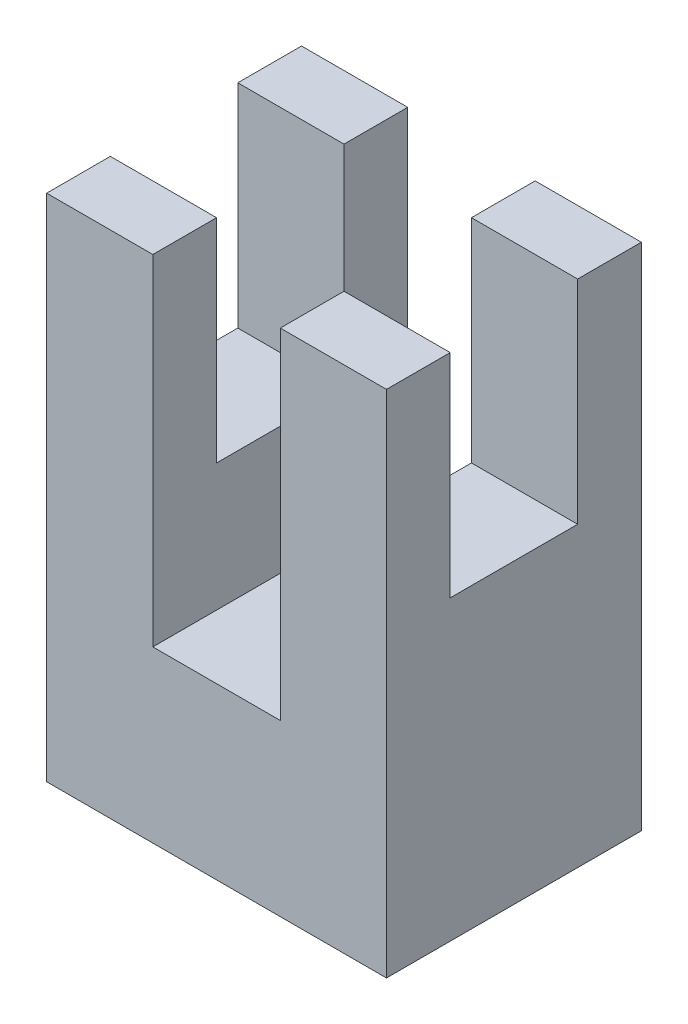
ISO-10303-21;
HEADER;
FILE_DESCRIPTION(('STEP AP214'),'2;1');
FILE_NAME('part.step','',(''),(''),'','','');
FILE_SCHEMA(('AUTOMOTIVE_DESIGN { 1 0 10303 214 1 1 1 1 }'));
ENDSEC;
DATA;
#1=APPLICATION_CONTEXT('core data for automotive mechanical design processes');
#2=APPLICATION_PROTOCOL_DEFINITION('international standard','automotive_design',2000,#1);
#3=PRODUCT_CONTEXT('',#1,'mechanical');
#4=PRODUCT('Part','Part','',(#3));
#5=PRODUCT_RELATED_PRODUCT_CATEGORY('part','',(#4));
#6=PRODUCT_DEFINITION_FORMATION('','',#4);
#7=PRODUCT_DEFINITION_CONTEXT('part definition',#1,'design');
#8=PRODUCT_DEFINITION('design','',#6,#7);
#9=PRODUCT_DEFINITION_SHAPE('','',#8);
#10=(LENGTH_UNIT() NAMED_UNIT(*) SI_UNIT(.MILLI.,.METRE.));
#11=(NAMED_UNIT(*) PLANE_ANGLE_UNIT() SI_UNIT($,.RADIAN.));
#12=(NAMED_UNIT(*) SI_UNIT($,.STERADIAN.) SOLID_ANGLE_UNIT());
#13=UNCERTAINTY_MEASURE_WITH_UNIT(LENGTH_MEASURE(1.E-05),#10,'distance_accuracy_value','');
#14=(GEOMETRIC_REPRESENTATION_CONTEXT(3) GLOBAL_UNCERTAINTY_ASSIGNED_CONTEXT((#13)) GLOBAL_UNIT_ASSIGNED_CONTEXT((#10,
#11,#12)) REPRESENTATION_CONTEXT('',''));
#15=CARTESIAN_POINT('',(0.,0.,0.));
#16=DIRECTION('',(0.,0.,1.));
#17=DIRECTION('',(1.,0.,0.));
#18=AXIS2_PLACEMENT_3D('',#15,#16,#17);
#19=CARTESIAN_POINT('',(-20.,60.,15.));
#20=DIRECTION('',(1.,0.,0.));
#21=DIRECTION('',(0.,1.,0.));
#22=AXIS2_PLACEMENT_3D('',#19,#20,#21);
#23=PLANE('',#22);
#24=DIRECTION('',(0.,-1.,0.));
#25=VECTOR('',#24,1.);
#26=CARTESIAN_POINT('',(-20.,60.,7.5));
#27=LINE('',#26,#25);
#28=CARTESIAN_POINT('',(-20.,60.,7.5));
#29=VERTEX_POINT('',#28);
#30=CARTESIAN_POINT('',(-20.,35.,7.5));
#31=VERTEX_POINT('',#30);
#32=EDGE_CURVE('E151',#29,#31,#27,.T.);
#33=ORIENTED_EDGE('',*,*,#32,.T.);
#34=DIRECTION('',(0.,0.,-1.));
#35=VECTOR('',#34,1.);
#36=CARTESIAN_POINT('',(-20.,35.,7.5));
#37=LINE('',#36,#35);
#38=CARTESIAN_POINT('',(-20.,35.,-7.5));
#39=VERTEX_POINT('',#38);
#40=EDGE_CURVE('E287',#31,#39,#37,.T.);
#41=ORIENTED_EDGE('',*,*,#40,.T.);
#42=DIRECTION('',(0.,1.,0.));
#43=VECTOR('',#42,1.);
#44=CARTESIAN_POINT('',(-20.,35.,-7.5));
#45=LINE('',#44,#43);
#46=CARTESIAN_POINT('',(-20.,60.,-7.5));
#47=VERTEX_POINT('',#46);
#48=EDGE_CURVE('E166',#39,#47,#45,.T.);
#49=ORIENTED_EDGE('',*,*,#48,.T.);
#50=DIRECTION('',(0.,0.,-1.));
#51=VECTOR('',#50,1.);
#52=CARTESIAN_POINT('',(-20.,60.,15.));
#53=LINE('',#52,#51);
#54=CARTESIAN_POINT('',(-20.,60.,-15.));
#55=VERTEX_POINT('',#54);
#56=EDGE_CURVE('E247',#47,#55,#53,.T.);
#57=ORIENTED_EDGE('',*,*,#56,.T.);
#58=DIRECTION('',(0.,-1.,0.));
#59=VECTOR('',#58,1.);
#60=CARTESIAN_POINT('',(-20.,60.,-15.));
#61=LINE('',#60,#59);
#62=CARTESIAN_POINT('',(-20.,0.,-15.));
#63=VERTEX_POINT('',#62);
#64=EDGE_CURVE('E212',#55,#63,#61,.T.);
#65=ORIENTED_EDGE('',*,*,#64,.T.);
#66=DIRECTION('',(0.,0.,-1.));
#67=VECTOR('',#66,1.);
#68=CARTESIAN_POINT('',(-20.,0.,15.));
#69=LINE('',#68,#67);
#70=CARTESIAN_POINT('',(-20.,0.,15.));
#71=VERTEX_POINT('',#70);
#72=EDGE_CURVE('E11',#71,#63,#69,.T.);
#73=ORIENTED_EDGE('',*,*,#72,.F.);
#74=DIRECTION('',(0.,-1.,0.));
#75=VECTOR('',#74,1.);
#76=CARTESIAN_POINT('',(-20.,60.,15.));
#77=LINE('',#76,#75);
#78=CARTESIAN_POINT('',(-20.,60.,15.));
#79=VERTEX_POINT('',#78);
#80=EDGE_CURVE('E223',#79,#71,#77,.T.);
#81=ORIENTED_EDGE('',*,*,#80,.F.);
#82=EDGE_CURVE('E176',#79,#29,#53,.T.);
#83=ORIENTED_EDGE('',*,*,#82,.T.);
#84=EDGE_LOOP('',(#33,#41,#49,#57,#65,#73,#81,#83));
#85=FACE_BOUND('',#84,.T.);
#86=ADVANCED_FACE('F33',(#85),#23,.F.);
#87=CARTESIAN_POINT('',(-7.5,20.,15.));
#88=DIRECTION('',(-1.,0.,0.));
#89=DIRECTION('',(0.,0.,1.));
#90=AXIS2_PLACEMENT_3D('',#87,#88,#89);
#91=PLANE('',#90);
#92=DIRECTION('',(0.,1.,0.));
#93=VECTOR('',#92,1.);
#94=CARTESIAN_POINT('',(-7.5,60.,7.5));
#95=LINE('',#94,#93);
#96=CARTESIAN_POINT('',(-7.5,35.,7.5));
#97=VERTEX_POINT('',#96);
#98=CARTESIAN_POINT('',(-7.5,60.,7.5));
#99=VERTEX_POINT('',#98);
#100=EDGE_CURVE('E148',#97,#99,#95,.T.);
#101=ORIENTED_EDGE('',*,*,#100,.T.);
#102=DIRECTION('',(0.,0.,-1.));
#103=VECTOR('',#102,1.);
#104=CARTESIAN_POINT('',(-7.5,60.,15.));
#105=LINE('',#104,#103);
#106=CARTESIAN_POINT('',(-7.5,60.,15.));
#107=VERTEX_POINT('',#106);
#108=EDGE_CURVE('E163',#107,#99,#105,.T.);
#109=ORIENTED_EDGE('',*,*,#108,.F.);
#110=DIRECTION('',(0.,1.,0.));
#111=VECTOR('',#110,1.);
#112=CARTESIAN_POINT('',(-7.5,20.,15.));
#113=LINE('',#112,#111);
#114=CARTESIAN_POINT('',(-7.5,20.,15.));
#115=VERTEX_POINT('',#114);
#116=EDGE_CURVE('E245',#115,#107,#113,.T.);
#117=ORIENTED_EDGE('',*,*,#116,.F.);
#118=DIRECTION('',(0.,0.,-1.));
#119=VECTOR('',#118,1.);
#120=CARTESIAN_POINT('',(-7.5,20.,15.));
#121=LINE('',#120,#119);
#122=CARTESIAN_POINT('',(-7.5,20.,-15.));
#123=VERTEX_POINT('',#122);
#124=EDGE_CURVE('E170',#115,#123,#121,.T.);
#125=ORIENTED_EDGE('',*,*,#124,.T.);
#126=DIRECTION('',(0.,1.,0.));
#127=VECTOR('',#126,1.);
#128=CARTESIAN_POINT('',(-7.5,20.,-15.));
#129=LINE('',#128,#127);
#130=CARTESIAN_POINT('',(-7.5,60.,-15.));
#131=VERTEX_POINT('',#130);
#132=EDGE_CURVE('E219',#123,#131,#129,.T.);
#133=ORIENTED_EDGE('',*,*,#132,.T.);
#134=CARTESIAN_POINT('',(-7.5,60.,-7.5));
#135=VERTEX_POINT('',#134);
#136=EDGE_CURVE('E171',#135,#131,#105,.T.);
#137=ORIENTED_EDGE('',*,*,#136,.F.);
#138=DIRECTION('',(0.,-1.,0.));
#139=VECTOR('',#138,1.);
#140=CARTESIAN_POINT('',(-7.5,35.,-7.5));
#141=LINE('',#140,#139);
#142=CARTESIAN_POINT('',(-7.5,35.,-7.5));
#143=VERTEX_POINT('',#142);
#144=EDGE_CURVE('E47',#135,#143,#141,.T.);
#145=ORIENTED_EDGE('',*,*,#144,.T.);
#146=DIRECTION('',(0.,0.,1.));
#147=VECTOR('',#146,1.);
#148=CARTESIAN_POINT('',(-7.5,35.,7.5));
#149=LINE('',#148,#147);
#150=EDGE_CURVE('E165',#143,#97,#149,.T.);
#151=ORIENTED_EDGE('',*,*,#150,.T.);
#152=EDGE_LOOP('',(#101,#109,#117,#125,#133,#137,#145,#151));
#153=FACE_BOUND('',#152,.T.);
#154=ADVANCED_FACE('F161',(#153),#91,.F.);
#155=CARTESIAN_POINT('',(-7.5,60.,15.));
#156=DIRECTION('',(0.,-1.,0.));
#157=DIRECTION('',(0.,0.,-1.));
#158=AXIS2_PLACEMENT_3D('',#155,#156,#157);
#159=PLANE('',#158);
#160=DIRECTION('',(-1.,0.,0.));
#161=VECTOR('',#160,1.);
#162=CARTESIAN_POINT('',(20.001,60.,7.5));
#163=LINE('',#162,#161);
#164=EDGE_CURVE('E145',#99,#29,#163,.T.);
#165=ORIENTED_EDGE('',*,*,#164,.T.);
#166=ORIENTED_EDGE('',*,*,#82,.F.);
#167=DIRECTION('',(-1.,0.,0.));
#168=VECTOR('',#167,1.);
#169=CARTESIAN_POINT('',(-7.5,60.,15.));
#170=LINE('',#169,#168);
#171=EDGE_CURVE('E169',#107,#79,#170,.T.);
#172=ORIENTED_EDGE('',*,*,#171,.F.);
#173=ORIENTED_EDGE('',*,*,#108,.T.);
#174=EDGE_LOOP('',(#165,#166,#172,#173));
#175=FACE_BOUND('',#174,.T.);
#176=ADVANCED_FACE('F168',(#175),#159,.F.);
#177=DIRECTION('',(-1.,0.,0.));
#178=VECTOR('',#177,1.);
#179=CARTESIAN_POINT('',(20.001,60.,-7.5));
#180=LINE('',#179,#178);
#181=EDGE_CURVE('E281',#135,#47,#180,.T.);
#182=ORIENTED_EDGE('',*,*,#181,.F.);
#183=ORIENTED_EDGE('',*,*,#136,.T.);
#184=DIRECTION('',(-1.,0.,0.));
#185=VECTOR('',#184,1.);
#186=CARTESIAN_POINT('',(-7.5,60.,-15.));
#187=LINE('',#186,#185);
#188=EDGE_CURVE('E221',#131,#55,#187,.T.);
#189=ORIENTED_EDGE('',*,*,#188,.T.);
#190=ORIENTED_EDGE('',*,*,#56,.F.);
#191=EDGE_LOOP('',(#182,#183,#189,#190));
#192=FACE_BOUND('',#191,.T.);
#193=ADVANCED_FACE('F294',(#192),#159,.F.);
#194=CARTESIAN_POINT('',(20.,60.,15.));
#195=DIRECTION('',(0.,-1.,0.));
#196=DIRECTION('',(1.,0.,0.));
#197=AXIS2_PLACEMENT_3D('',#194,#195,#196);
#198=PLANE('',#197);
#199=DIRECTION('',(0.,0.,-1.));
#200=VECTOR('',#199,1.);
#201=CARTESIAN_POINT('',(7.49999999999998,60.,15.));
#202=LINE('',#201,#200);
#203=CARTESIAN_POINT('',(7.49999999999998,60.,-7.5));
#204=VERTEX_POINT('',#203);
#205=CARTESIAN_POINT('',(7.49999999999998,60.,-15.));
#206=VERTEX_POINT('',#205);
#207=EDGE_CURVE('E182',#204,#206,#202,.T.);
#208=ORIENTED_EDGE('',*,*,#207,.F.);
#209=DIRECTION('',(1.,0.,0.));
#210=VECTOR('',#209,1.);
#211=CARTESIAN_POINT('',(-20.001,60.,-7.5));
#212=LINE('',#211,#210);
#213=CARTESIAN_POINT('',(20.,60.,-7.5));
#214=VERTEX_POINT('',#213);
#215=EDGE_CURVE('E250',#204,#214,#212,.T.);
#216=ORIENTED_EDGE('',*,*,#215,.T.);
#217=DIRECTION('',(0.,0.,-1.));
#218=VECTOR('',#217,1.);
#219=CARTESIAN_POINT('',(20.,60.,15.));
#220=LINE('',#219,#218);
#221=CARTESIAN_POINT('',(20.,60.,-15.));
#222=VERTEX_POINT('',#221);
#223=EDGE_CURVE('E186',#214,#222,#220,.T.);
#224=ORIENTED_EDGE('',*,*,#223,.T.);
#225=DIRECTION('',(-1.,0.,0.));
#226=VECTOR('',#225,1.);
#227=CARTESIAN_POINT('',(20.,60.,-15.));
#228=LINE('',#227,#226);
#229=EDGE_CURVE('E208',#222,#206,#228,.T.);
#230=ORIENTED_EDGE('',*,*,#229,.T.);
#231=EDGE_LOOP('',(#208,#216,#224,#230));
#232=FACE_BOUND('',#231,.T.);
#233=ADVANCED_FACE('F313',(#232),#198,.F.);
#234=CARTESIAN_POINT('',(-20.,0.,15.));
#235=DIRECTION('',(0.,1.,0.));
#236=DIRECTION('',(-1.,0.,0.));
#237=AXIS2_PLACEMENT_3D('',#234,#235,#236);
#238=PLANE('',#237);
#239=DIRECTION('',(1.,0.,0.));
#240=VECTOR('',#239,1.);
#241=CARTESIAN_POINT('',(-20.,0.,-15.));
#242=LINE('',#241,#240);
#243=CARTESIAN_POINT('',(20.,0.,-15.));
#244=VERTEX_POINT('',#243);
#245=EDGE_CURVE('E205',#63,#244,#242,.T.);
#246=ORIENTED_EDGE('',*,*,#245,.T.);
#247=DIRECTION('',(0.,0.,-1.));
#248=VECTOR('',#247,1.);
#249=CARTESIAN_POINT('',(20.,0.,15.));
#250=LINE('',#249,#248);
#251=CARTESIAN_POINT('',(20.,0.,15.));
#252=VERTEX_POINT('',#251);
#253=EDGE_CURVE('E40',#252,#244,#250,.T.);
#254=ORIENTED_EDGE('',*,*,#253,.F.);
#255=DIRECTION('',(1.,0.,0.));
#256=VECTOR('',#255,1.);
#257=CARTESIAN_POINT('',(-20.,0.,15.));
#258=LINE('',#257,#256);
#259=EDGE_CURVE('E228',#71,#252,#258,.T.);
#260=ORIENTED_EDGE('',*,*,#259,.F.);
#261=ORIENTED_EDGE('',*,*,#72,.T.);
#262=EDGE_LOOP('',(#246,#254,#260,#261));
#263=FACE_BOUND('',#262,.T.);
#264=ADVANCED_FACE('F296',(#263),#238,.F.);
#265=CARTESIAN_POINT('',(20.,0.,15.));
#266=DIRECTION('',(-1.,0.,0.));
#267=DIRECTION('',(0.,0.,1.));
#268=AXIS2_PLACEMENT_3D('',#265,#266,#267);
#269=PLANE('',#268);
#270=ORIENTED_EDGE('',*,*,#223,.F.);
#271=DIRECTION('',(0.,1.,0.));
#272=VECTOR('',#271,1.);
#273=CARTESIAN_POINT('',(20.,35.,-7.5));
#274=LINE('',#273,#272);
#275=CARTESIAN_POINT('',(20.,35.,-7.5));
#276=VERTEX_POINT('',#275);
#277=EDGE_CURVE('E262',#276,#214,#274,.T.);
#278=ORIENTED_EDGE('',*,*,#277,.F.);
#279=DIRECTION('',(0.,0.,-1.));
#280=VECTOR('',#279,1.);
#281=CARTESIAN_POINT('',(20.,35.,7.5));
#282=LINE('',#281,#280);
#283=CARTESIAN_POINT('',(20.,35.,7.5));
#284=VERTEX_POINT('',#283);
#285=EDGE_CURVE('E268',#284,#276,#282,.T.);
#286=ORIENTED_EDGE('',*,*,#285,.F.);
#287=DIRECTION('',(0.,-1.,0.));
#288=VECTOR('',#287,1.);
#289=CARTESIAN_POINT('',(20.,60.,7.5));
#290=LINE('',#289,#288);
#291=CARTESIAN_POINT('',(20.,60.,7.5));
#292=VERTEX_POINT('',#291);
#293=EDGE_CURVE('E272',#292,#284,#290,.T.);
#294=ORIENTED_EDGE('',*,*,#293,.F.);
#295=CARTESIAN_POINT('',(20.,60.,15.));
#296=VERTEX_POINT('',#295);
#297=EDGE_CURVE('E187',#296,#292,#220,.T.);
#298=ORIENTED_EDGE('',*,*,#297,.F.);
#299=DIRECTION('',(0.,1.,0.));
#300=VECTOR('',#299,1.);
#301=CARTESIAN_POINT('',(20.,0.,15.));
#302=LINE('',#301,#300);
#303=EDGE_CURVE('E200',#252,#296,#302,.T.);
#304=ORIENTED_EDGE('',*,*,#303,.F.);
#305=ORIENTED_EDGE('',*,*,#253,.T.);
#306=DIRECTION('',(0.,1.,0.));
#307=VECTOR('',#306,1.);
#308=CARTESIAN_POINT('',(20.,0.,-15.));
#309=LINE('',#308,#307);
#310=EDGE_CURVE('E197',#244,#222,#309,.T.);
#311=ORIENTED_EDGE('',*,*,#310,.T.);
#312=EDGE_LOOP('',(#270,#278,#286,#294,#298,#304,#305,#311));
#313=FACE_BOUND('',#312,.T.);
#314=ADVANCED_FACE('F196',(#313),#269,.F.);
#315=ORIENTED_EDGE('',*,*,#297,.T.);
#316=DIRECTION('',(1.,0.,0.));
#317=VECTOR('',#316,1.);
#318=CARTESIAN_POINT('',(-20.001,60.,7.5));
#319=LINE('',#318,#317);
#320=CARTESIAN_POINT('',(7.49999999999998,60.,7.5));
#321=VERTEX_POINT('',#320);
#322=EDGE_CURVE('E265',#321,#292,#319,.T.);
#323=ORIENTED_EDGE('',*,*,#322,.F.);
#324=CARTESIAN_POINT('',(7.49999999999998,60.,15.));
#325=VERTEX_POINT('',#324);
#326=EDGE_CURVE('E183',#325,#321,#202,.T.);
#327=ORIENTED_EDGE('',*,*,#326,.F.);
#328=DIRECTION('',(-1.,0.,0.));
#329=VECTOR('',#328,1.);
#330=CARTESIAN_POINT('',(20.,60.,15.));
#331=LINE('',#330,#329);
#332=EDGE_CURVE('E239',#296,#325,#331,.T.);
#333=ORIENTED_EDGE('',*,*,#332,.F.);
#334=EDGE_LOOP('',(#315,#323,#327,#333));
#335=FACE_BOUND('',#334,.T.);
#336=ADVANCED_FACE('F301',(#335),#198,.F.);
#337=CARTESIAN_POINT('',(7.49999999999998,60.,15.));
#338=DIRECTION('',(1.,0.,0.));
#339=DIRECTION('',(0.,1.,0.));
#340=AXIS2_PLACEMENT_3D('',#337,#338,#339);
#341=PLANE('',#340);
#342=DIRECTION('',(0.,0.,1.));
#343=VECTOR('',#342,1.);
#344=CARTESIAN_POINT('',(7.49999999999999,35.,7.5));
#345=LINE('',#344,#343);
#346=CARTESIAN_POINT('',(7.49999999999999,35.,-7.5));
#347=VERTEX_POINT('',#346);
#348=CARTESIAN_POINT('',(7.49999999999999,35.,7.5));
#349=VERTEX_POINT('',#348);
#350=EDGE_CURVE('E55',#347,#349,#345,.T.);
#351=ORIENTED_EDGE('',*,*,#350,.F.);
#352=DIRECTION('',(0.,-1.,0.));
#353=VECTOR('',#352,1.);
#354=CARTESIAN_POINT('',(7.49999999999999,35.,-7.5));
#355=LINE('',#354,#353);
#356=EDGE_CURVE('E274',#204,#347,#355,.T.);
#357=ORIENTED_EDGE('',*,*,#356,.F.);
#358=ORIENTED_EDGE('',*,*,#207,.T.);
#359=DIRECTION('',(0.,-1.,0.));
#360=VECTOR('',#359,1.);
#361=CARTESIAN_POINT('',(7.49999999999998,60.,-15.));
#362=LINE('',#361,#360);
#363=CARTESIAN_POINT('',(7.5,20.,-15.));
#364=VERTEX_POINT('',#363);
#365=EDGE_CURVE('E210',#206,#364,#362,.T.);
#366=ORIENTED_EDGE('',*,*,#365,.T.);
#367=DIRECTION('',(0.,0.,-1.));
#368=VECTOR('',#367,1.);
#369=CARTESIAN_POINT('',(7.5,20.,15.));
#370=LINE('',#369,#368);
#371=CARTESIAN_POINT('',(7.5,20.,15.));
#372=VERTEX_POINT('',#371);
#373=EDGE_CURVE('E174',#372,#364,#370,.T.);
#374=ORIENTED_EDGE('',*,*,#373,.F.);
#375=DIRECTION('',(0.,-1.,0.));
#376=VECTOR('',#375,1.);
#377=CARTESIAN_POINT('',(7.49999999999998,60.,15.));
#378=LINE('',#377,#376);
#379=EDGE_CURVE('E241',#325,#372,#378,.T.);
#380=ORIENTED_EDGE('',*,*,#379,.F.);
#381=ORIENTED_EDGE('',*,*,#326,.T.);
#382=DIRECTION('',(0.,1.,0.));
#383=VECTOR('',#382,1.);
#384=CARTESIAN_POINT('',(7.49999999999998,60.,7.5));
#385=LINE('',#384,#383);
#386=EDGE_CURVE('E235',#349,#321,#385,.T.);
#387=ORIENTED_EDGE('',*,*,#386,.F.);
#388=EDGE_LOOP('',(#351,#357,#358,#366,#374,#380,#381,#387));
#389=FACE_BOUND('',#388,.T.);
#390=ADVANCED_FACE('F305',(#389),#341,.F.);
#391=CARTESIAN_POINT('',(7.5,20.,15.));
#392=DIRECTION('',(0.,-1.,0.));
#393=DIRECTION('',(1.,0.,0.));
#394=AXIS2_PLACEMENT_3D('',#391,#392,#393);
#395=PLANE('',#394);
#396=DIRECTION('',(-1.,0.,0.));
#397=VECTOR('',#396,1.);
#398=CARTESIAN_POINT('',(7.5,20.,-15.));
#399=LINE('',#398,#397);
#400=EDGE_CURVE('E217',#364,#123,#399,.T.);
#401=ORIENTED_EDGE('',*,*,#400,.T.);
#402=ORIENTED_EDGE('',*,*,#124,.F.);
#403=DIRECTION('',(-1.,0.,0.));
#404=VECTOR('',#403,1.);
#405=CARTESIAN_POINT('',(7.5,20.,15.));
#406=LINE('',#405,#404);
#407=EDGE_CURVE('E243',#372,#115,#406,.T.);
#408=ORIENTED_EDGE('',*,*,#407,.F.);
#409=ORIENTED_EDGE('',*,*,#373,.T.);
#410=EDGE_LOOP('',(#401,#402,#408,#409));
#411=FACE_BOUND('',#410,.T.);
#412=ADVANCED_FACE('F309',(#411),#395,.F.);
#413=CARTESIAN_POINT('',(0.,0.,15.));
#414=DIRECTION('',(0.,0.,1.));
#415=DIRECTION('',(1.,0.,0.));
#416=AXIS2_PLACEMENT_3D('',#413,#414,#415);
#417=PLANE('',#416);
#418=ORIENTED_EDGE('',*,*,#80,.T.);
#419=ORIENTED_EDGE('',*,*,#259,.T.);
#420=ORIENTED_EDGE('',*,*,#303,.T.);
#421=ORIENTED_EDGE('',*,*,#332,.T.);
#422=ORIENTED_EDGE('',*,*,#379,.T.);
#423=ORIENTED_EDGE('',*,*,#407,.T.);
#424=ORIENTED_EDGE('',*,*,#116,.T.);
#425=ORIENTED_EDGE('',*,*,#171,.T.);
#426=EDGE_LOOP('',(#418,#419,#420,#421,#422,#423,#424,#425));
#427=FACE_BOUND('',#426,.T.);
#428=ADVANCED_FACE('F297',(#427),#417,.T.);
#429=CARTESIAN_POINT('',(0.,0.,-15.));
#430=DIRECTION('',(0.,0.,1.));
#431=DIRECTION('',(1.,0.,0.));
#432=AXIS2_PLACEMENT_3D('',#429,#430,#431);
#433=PLANE('',#432);
#434=ORIENTED_EDGE('',*,*,#64,.F.);
#435=ORIENTED_EDGE('',*,*,#188,.F.);
#436=ORIENTED_EDGE('',*,*,#132,.F.);
#437=ORIENTED_EDGE('',*,*,#400,.F.);
#438=ORIENTED_EDGE('',*,*,#365,.F.);
#439=ORIENTED_EDGE('',*,*,#229,.F.);
#440=ORIENTED_EDGE('',*,*,#310,.F.);
#441=ORIENTED_EDGE('',*,*,#245,.F.);
#442=EDGE_LOOP('',(#434,#435,#436,#437,#438,#439,#440,#441));
#443=FACE_BOUND('',#442,.T.);
#444=ADVANCED_FACE('F204',(#443),#433,.F.);
#445=CARTESIAN_POINT('',(-20.001,35.,-7.5));
#446=DIRECTION('',(0.,0.,-1.));
#447=DIRECTION('',(0.,1.,0.));
#448=AXIS2_PLACEMENT_3D('',#445,#446,#447);
#449=PLANE('',#448);
#450=ORIENTED_EDGE('',*,*,#356,.T.);
#451=DIRECTION('',(1.,0.,0.));
#452=VECTOR('',#451,1.);
#453=CARTESIAN_POINT('',(-20.001,35.,-7.5));
#454=LINE('',#453,#452);
#455=EDGE_CURVE('E255',#347,#276,#454,.T.);
#456=ORIENTED_EDGE('',*,*,#455,.T.);
#457=ORIENTED_EDGE('',*,*,#277,.T.);
#458=ORIENTED_EDGE('',*,*,#215,.F.);
#459=EDGE_LOOP('',(#450,#456,#457,#458));
#460=FACE_BOUND('',#459,.T.);
#461=ADVANCED_FACE('F359',(#460),#449,.F.);
#462=CARTESIAN_POINT('',(-20.001,35.,7.5));
#463=DIRECTION('',(0.,-1.,0.));
#464=DIRECTION('',(0.,0.,-1.));
#465=AXIS2_PLACEMENT_3D('',#462,#463,#464);
#466=PLANE('',#465);
#467=ORIENTED_EDGE('',*,*,#350,.T.);
#468=DIRECTION('',(1.,0.,0.));
#469=VECTOR('',#468,1.);
#470=CARTESIAN_POINT('',(-20.001,35.,7.5));
#471=LINE('',#470,#469);
#472=EDGE_CURVE('E259',#349,#284,#471,.T.);
#473=ORIENTED_EDGE('',*,*,#472,.T.);
#474=ORIENTED_EDGE('',*,*,#285,.T.);
#475=ORIENTED_EDGE('',*,*,#455,.F.);
#476=EDGE_LOOP('',(#467,#473,#474,#475));
#477=FACE_BOUND('',#476,.T.);
#478=ADVANCED_FACE('F364',(#477),#466,.F.);
#479=CARTESIAN_POINT('',(-20.001,60.,7.5));
#480=DIRECTION('',(0.,0.,1.));
#481=DIRECTION('',(0.,-1.,0.));
#482=AXIS2_PLACEMENT_3D('',#479,#480,#481);
#483=PLANE('',#482);
#484=ORIENTED_EDGE('',*,*,#386,.T.);
#485=ORIENTED_EDGE('',*,*,#322,.T.);
#486=ORIENTED_EDGE('',*,*,#293,.T.);
#487=ORIENTED_EDGE('',*,*,#472,.F.);
#488=EDGE_LOOP('',(#484,#485,#486,#487));
#489=FACE_BOUND('',#488,.T.);
#490=ADVANCED_FACE('F371',(#489),#483,.F.);
#491=CARTESIAN_POINT('',(20.001,60.,7.5));
#492=DIRECTION('',(0.,0.,-1.));
#493=DIRECTION('',(0.,1.,0.));
#494=AXIS2_PLACEMENT_3D('',#491,#492,#493);
#495=PLANE('',#494);
#496=DIRECTION('',(-1.,0.,0.));
#497=VECTOR('',#496,1.);
#498=CARTESIAN_POINT('',(20.001,35.,7.5));
#499=LINE('',#498,#497);
#500=EDGE_CURVE('E156',#97,#31,#499,.T.);
#501=ORIENTED_EDGE('',*,*,#500,.T.);
#502=ORIENTED_EDGE('',*,*,#32,.F.);
#503=ORIENTED_EDGE('',*,*,#164,.F.);
#504=ORIENTED_EDGE('',*,*,#100,.F.);
#505=EDGE_LOOP('',(#501,#502,#503,#504));
#506=FACE_BOUND('',#505,.T.);
#507=ADVANCED_FACE('F147',(#506),#495,.T.);
#508=CARTESIAN_POINT('',(20.001,35.,7.5));
#509=DIRECTION('',(0.,1.,0.));
#510=DIRECTION('',(0.,0.,1.));
#511=AXIS2_PLACEMENT_3D('',#508,#509,#510);
#512=PLANE('',#511);
#513=DIRECTION('',(-1.,0.,0.));
#514=VECTOR('',#513,1.);
#515=CARTESIAN_POINT('',(20.001,35.,-7.5));
#516=LINE('',#515,#514);
#517=EDGE_CURVE('E283',#143,#39,#516,.T.);
#518=ORIENTED_EDGE('',*,*,#517,.T.);
#519=ORIENTED_EDGE('',*,*,#40,.F.);
#520=ORIENTED_EDGE('',*,*,#500,.F.);
#521=ORIENTED_EDGE('',*,*,#150,.F.);
#522=EDGE_LOOP('',(#518,#519,#520,#521));
#523=FACE_BOUND('',#522,.T.);
#524=ADVANCED_FACE('F384',(#523),#512,.T.);
#525=CARTESIAN_POINT('',(20.001,35.,-7.5));
#526=DIRECTION('',(0.,0.,1.));
#527=DIRECTION('',(0.,-1.,0.));
#528=AXIS2_PLACEMENT_3D('',#525,#526,#527);
#529=PLANE('',#528);
#530=ORIENTED_EDGE('',*,*,#181,.T.);
#531=ORIENTED_EDGE('',*,*,#48,.F.);
#532=ORIENTED_EDGE('',*,*,#517,.F.);
#533=ORIENTED_EDGE('',*,*,#144,.F.);
#534=EDGE_LOOP('',(#530,#531,#532,#533));
#535=FACE_BOUND('',#534,.T.);
#536=ADVANCED_FACE('F392',(#535),#529,.T.);
#537=CLOSED_SHELL('',(#86,#154,#176,#193,#233,#264,#314,#336,#390,#412,#428,#444,#461,#478,#490,
#507,#524,#536));
#538=MANIFOLD_SOLID_BREP('B2',#537);
#539=ADVANCED_BREP_SHAPE_REPRESENTATION('',(#18,#538),#14);
#540=SHAPE_DEFINITION_REPRESENTATION(#9,#539);
ENDSEC;
END-ISO-10303-21;
